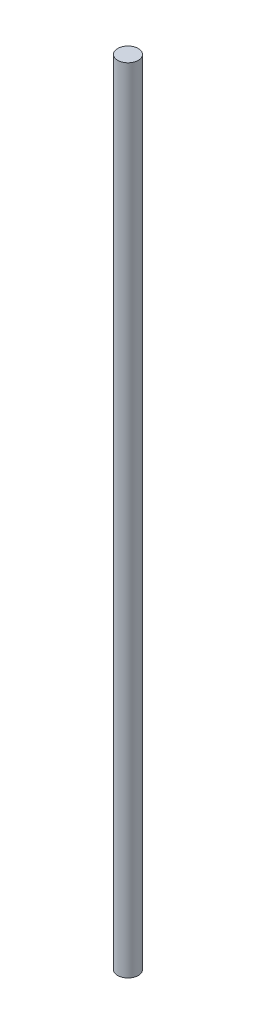
ISO-10303-21;
HEADER;
FILE_DESCRIPTION(('STEP AP214'),'2;1');
FILE_NAME('part.step','',(''),(''),'','','');
FILE_SCHEMA(('AUTOMOTIVE_DESIGN { 1 0 10303 214 1 1 1 1 }'));
ENDSEC;
DATA;
#1=APPLICATION_CONTEXT('core data for automotive mechanical design processes');
#2=APPLICATION_PROTOCOL_DEFINITION('international standard','automotive_design',2000,#1);
#3=PRODUCT_CONTEXT('',#1,'mechanical');
#4=PRODUCT('Part','Part','',(#3));
#5=PRODUCT_RELATED_PRODUCT_CATEGORY('part','',(#4));
#6=PRODUCT_DEFINITION_FORMATION('','',#4);
#7=PRODUCT_DEFINITION_CONTEXT('part definition',#1,'design');
#8=PRODUCT_DEFINITION('design','',#6,#7);
#9=PRODUCT_DEFINITION_SHAPE('','',#8);
#10=(LENGTH_UNIT() NAMED_UNIT(*) SI_UNIT(.MILLI.,.METRE.));
#11=(NAMED_UNIT(*) PLANE_ANGLE_UNIT() SI_UNIT($,.RADIAN.));
#12=(NAMED_UNIT(*) SI_UNIT($,.STERADIAN.) SOLID_ANGLE_UNIT());
#13=UNCERTAINTY_MEASURE_WITH_UNIT(LENGTH_MEASURE(1.E-05),#10,'distance_accuracy_value','');
#14=(GEOMETRIC_REPRESENTATION_CONTEXT(3) GLOBAL_UNCERTAINTY_ASSIGNED_CONTEXT((#13)) GLOBAL_UNIT_ASSIGNED_CONTEXT((#10,
#11,#12)) REPRESENTATION_CONTEXT('',''));
#15=CARTESIAN_POINT('',(0.,0.,0.));
#16=DIRECTION('',(0.,0.,1.));
#17=DIRECTION('',(1.,0.,0.));
#18=AXIS2_PLACEMENT_3D('',#15,#16,#17);
#19=CARTESIAN_POINT('',(0.,154.,0.));
#20=DIRECTION('',(0.,-1.,0.));
#21=DIRECTION('',(0.,0.,-1.));
#22=AXIS2_PLACEMENT_3D('',#19,#20,#21);
#23=CYLINDRICAL_SURFACE('',#22,4.);
#24=CARTESIAN_POINT('',(0.,154.,0.));
#25=DIRECTION('',(0.,1.,0.));
#26=DIRECTION('',(0.,0.,1.));
#27=AXIS2_PLACEMENT_3D('',#24,#25,#26);
#28=CIRCLE('',#27,4.);
#29=CARTESIAN_POINT('',(0.,154.,4.));
#30=VERTEX_POINT('',#29);
#31=EDGE_CURVE('E10',#30,#30,#28,.T.);
#32=ORIENTED_EDGE('',*,*,#31,.F.);
#33=EDGE_LOOP('',(#32));
#34=FACE_BOUND('',#33,.T.);
#35=CARTESIAN_POINT('',(0.,-154.,0.));
#36=DIRECTION('',(0.,1.,0.));
#37=DIRECTION('',(0.,0.,1.));
#38=AXIS2_PLACEMENT_3D('',#35,#36,#37);
#39=CIRCLE('',#38,4.);
#40=CARTESIAN_POINT('',(0.,-154.,4.));
#41=VERTEX_POINT('',#40);
#42=EDGE_CURVE('E18',#41,#41,#39,.T.);
#43=ORIENTED_EDGE('',*,*,#42,.T.);
#44=EDGE_LOOP('',(#43));
#45=FACE_BOUND('',#44,.T.);
#46=ADVANCED_FACE('F15',(#34,#45),#23,.T.);
#47=CARTESIAN_POINT('',(0.,154.,0.));
#48=DIRECTION('',(0.,1.,0.));
#49=DIRECTION('',(0.,0.,1.));
#50=AXIS2_PLACEMENT_3D('',#47,#48,#49);
#51=PLANE('',#50);
#52=ORIENTED_EDGE('',*,*,#31,.T.);
#53=EDGE_LOOP('',(#52));
#54=FACE_BOUND('',#53,.T.);
#55=ADVANCED_FACE('F30',(#54),#51,.T.);
#56=CARTESIAN_POINT('',(0.,-154.,0.));
#57=DIRECTION('',(0.,1.,0.));
#58=DIRECTION('',(0.,0.,1.));
#59=AXIS2_PLACEMENT_3D('',#56,#57,#58);
#60=PLANE('',#59);
#61=ORIENTED_EDGE('',*,*,#42,.F.);
#62=EDGE_LOOP('',(#61));
#63=FACE_BOUND('',#62,.T.);
#64=ADVANCED_FACE('F28',(#63),#60,.F.);
#65=CLOSED_SHELL('',(#46,#55,#64));
#66=MANIFOLD_SOLID_BREP('B1',#65);
#67=ADVANCED_BREP_SHAPE_REPRESENTATION('',(#18,#66),#14);
#68=SHAPE_DEFINITION_REPRESENTATION(#9,#67);
ENDSEC;
END-ISO-10303-21;
